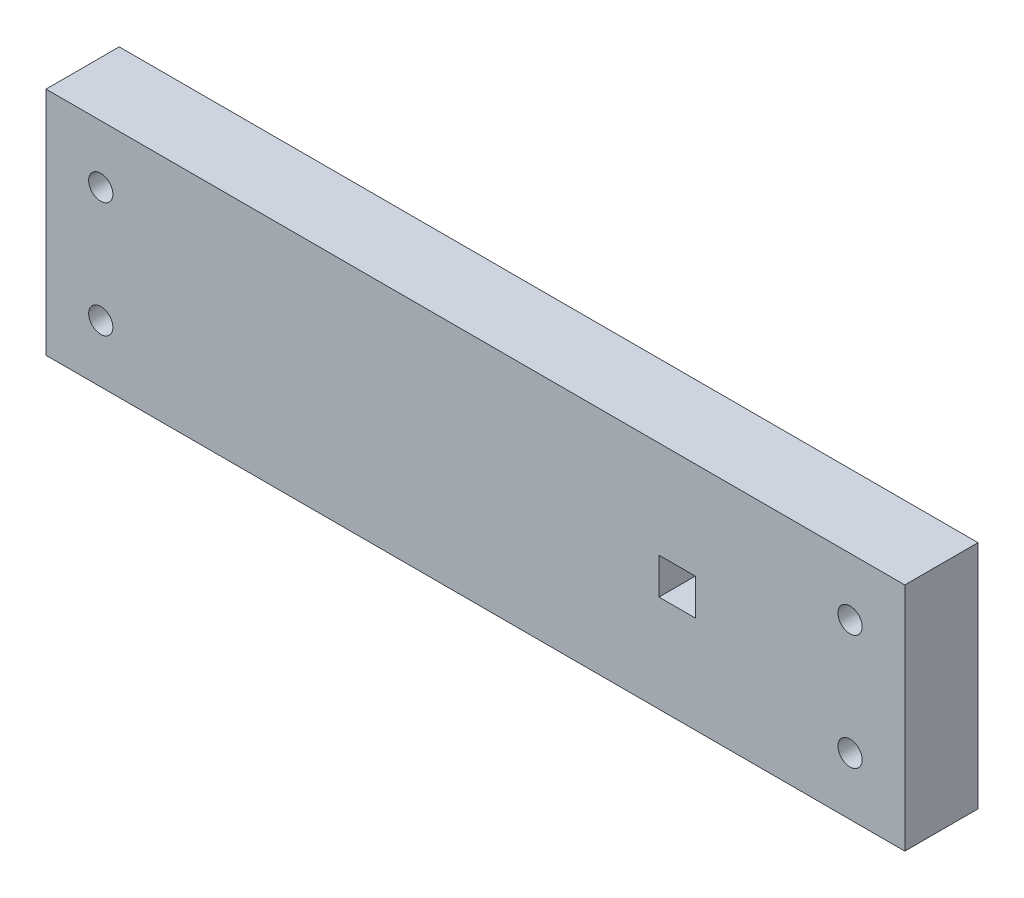
ISO-10303-21;
HEADER;
FILE_DESCRIPTION(('STEP AP214'),'2;1');
FILE_NAME('part.step','',(''),(''),'','','');
FILE_SCHEMA(('AUTOMOTIVE_DESIGN { 1 0 10303 214 1 1 1 1 }'));
ENDSEC;
DATA;
#1=APPLICATION_CONTEXT('core data for automotive mechanical design processes');
#2=APPLICATION_PROTOCOL_DEFINITION('international standard','automotive_design',2000,#1);
#3=PRODUCT_CONTEXT('',#1,'mechanical');
#4=PRODUCT('Part','Part','',(#3));
#5=PRODUCT_RELATED_PRODUCT_CATEGORY('part','',(#4));
#6=PRODUCT_DEFINITION_FORMATION('','',#4);
#7=PRODUCT_DEFINITION_CONTEXT('part definition',#1,'design');
#8=PRODUCT_DEFINITION('design','',#6,#7);
#9=PRODUCT_DEFINITION_SHAPE('','',#8);
#10=(LENGTH_UNIT() NAMED_UNIT(*) SI_UNIT(.MILLI.,.METRE.));
#11=(NAMED_UNIT(*) PLANE_ANGLE_UNIT() SI_UNIT($,.RADIAN.));
#12=(NAMED_UNIT(*) SI_UNIT($,.STERADIAN.) SOLID_ANGLE_UNIT());
#13=UNCERTAINTY_MEASURE_WITH_UNIT(LENGTH_MEASURE(1.E-05),#10,'distance_accuracy_value','');
#14=(GEOMETRIC_REPRESENTATION_CONTEXT(3) GLOBAL_UNCERTAINTY_ASSIGNED_CONTEXT((#13)) GLOBAL_UNIT_ASSIGNED_CONTEXT((#10,
#11,#12)) REPRESENTATION_CONTEXT('',''));
#15=CARTESIAN_POINT('',(0.,0.,0.));
#16=DIRECTION('',(0.,0.,1.));
#17=DIRECTION('',(1.,0.,0.));
#18=AXIS2_PLACEMENT_3D('',#15,#16,#17);
#19=CARTESIAN_POINT('',(0.,0.,12.7));
#20=DIRECTION('',(0.,0.,1.));
#21=DIRECTION('',(1.,0.,0.));
#22=AXIS2_PLACEMENT_3D('',#19,#20,#21);
#23=PLANE('',#22);
#24=CARTESIAN_POINT('',(-65.,30.,12.7));
#25=DIRECTION('',(0.,0.,1.));
#26=DIRECTION('',(1.,0.,0.));
#27=AXIS2_PLACEMENT_3D('',#24,#25,#26);
#28=CIRCLE('',#27,2.09999999999999);
#29=CARTESIAN_POINT('',(-62.9,30.,12.7));
#30=VERTEX_POINT('',#29);
#31=EDGE_CURVE('E332',#30,#30,#28,.T.);
#32=ORIENTED_EDGE('',*,*,#31,.F.);
#33=EDGE_LOOP('',(#32));
#34=FACE_BOUND('',#33,.T.);
#35=CARTESIAN_POINT('',(-65.,10.,12.7));
#36=DIRECTION('',(0.,0.,1.));
#37=DIRECTION('',(1.,0.,0.));
#38=AXIS2_PLACEMENT_3D('',#35,#36,#37);
#39=CIRCLE('',#38,2.09999999999999);
#40=CARTESIAN_POINT('',(-62.9,10.,12.7));
#41=VERTEX_POINT('',#40);
#42=EDGE_CURVE('E336',#41,#41,#39,.T.);
#43=ORIENTED_EDGE('',*,*,#42,.F.);
#44=EDGE_LOOP('',(#43));
#45=FACE_BOUND('',#44,.T.);
#46=CARTESIAN_POINT('',(65.,10.,12.7));
#47=DIRECTION('',(0.,0.,1.));
#48=DIRECTION('',(1.,0.,0.));
#49=AXIS2_PLACEMENT_3D('',#46,#47,#48);
#50=CIRCLE('',#49,2.09999999999999);
#51=CARTESIAN_POINT('',(67.1,10.,12.7));
#52=VERTEX_POINT('',#51);
#53=EDGE_CURVE('E346',#52,#52,#50,.T.);
#54=ORIENTED_EDGE('',*,*,#53,.F.);
#55=EDGE_LOOP('',(#54));
#56=FACE_BOUND('',#55,.T.);
#57=CARTESIAN_POINT('',(65.,30.,12.7));
#58=DIRECTION('',(0.,0.,1.));
#59=DIRECTION('',(1.,0.,0.));
#60=AXIS2_PLACEMENT_3D('',#57,#58,#59);
#61=CIRCLE('',#60,2.09999999999999);
#62=CARTESIAN_POINT('',(67.1,30.,12.7));
#63=VERTEX_POINT('',#62);
#64=EDGE_CURVE('E354',#63,#63,#61,.T.);
#65=ORIENTED_EDGE('',*,*,#64,.F.);
#66=EDGE_LOOP('',(#65));
#67=FACE_BOUND('',#66,.T.);
#68=DIRECTION('',(0.,-1.,0.));
#69=VECTOR('',#68,1.);
#70=CARTESIAN_POINT('',(-74.5,40.,12.7));
#71=LINE('',#70,#69);
#72=CARTESIAN_POINT('',(-74.5,40.,12.7));
#73=VERTEX_POINT('',#72);
#74=CARTESIAN_POINT('',(-74.5,0.,12.7));
#75=VERTEX_POINT('',#74);
#76=EDGE_CURVE('E195',#73,#75,#71,.T.);
#77=ORIENTED_EDGE('',*,*,#76,.T.);
#78=DIRECTION('',(1.,0.,0.));
#79=VECTOR('',#78,1.);
#80=CARTESIAN_POINT('',(-74.5,0.,12.7));
#81=LINE('',#80,#79);
#82=CARTESIAN_POINT('',(74.5,0.,12.7));
#83=VERTEX_POINT('',#82);
#84=EDGE_CURVE('E199',#75,#83,#81,.T.);
#85=ORIENTED_EDGE('',*,*,#84,.T.);
#86=DIRECTION('',(0.,1.,0.));
#87=VECTOR('',#86,1.);
#88=CARTESIAN_POINT('',(74.5,40.,12.7));
#89=LINE('',#88,#87);
#90=CARTESIAN_POINT('',(74.5,40.,12.7));
#91=VERTEX_POINT('',#90);
#92=EDGE_CURVE('E203',#83,#91,#89,.T.);
#93=ORIENTED_EDGE('',*,*,#92,.T.);
#94=DIRECTION('',(-1.,0.,0.));
#95=VECTOR('',#94,1.);
#96=CARTESIAN_POINT('',(-74.5,40.,12.7));
#97=LINE('',#96,#95);
#98=EDGE_CURVE('E206',#91,#73,#97,.T.);
#99=ORIENTED_EDGE('',*,*,#98,.T.);
#100=EDGE_LOOP('',(#77,#85,#93,#99));
#101=FACE_BOUND('',#100,.T.);
#102=DIRECTION('',(1.,0.,0.));
#103=VECTOR('',#102,1.);
#104=CARTESIAN_POINT('',(31.85,16.85,12.7));
#105=LINE('',#104,#103);
#106=CARTESIAN_POINT('',(31.85,16.85,12.7));
#107=VERTEX_POINT('',#106);
#108=CARTESIAN_POINT('',(38.15,16.85,12.7));
#109=VERTEX_POINT('',#108);
#110=EDGE_CURVE('E159',#107,#109,#105,.T.);
#111=ORIENTED_EDGE('',*,*,#110,.F.);
#112=DIRECTION('',(0.,-1.,0.));
#113=VECTOR('',#112,1.);
#114=CARTESIAN_POINT('',(31.85,23.15,12.7));
#115=LINE('',#114,#113);
#116=CARTESIAN_POINT('',(31.85,23.15,12.7));
#117=VERTEX_POINT('',#116);
#118=EDGE_CURVE('E156',#117,#107,#115,.T.);
#119=ORIENTED_EDGE('',*,*,#118,.F.);
#120=DIRECTION('',(-1.,0.,0.));
#121=VECTOR('',#120,1.);
#122=CARTESIAN_POINT('',(31.85,23.15,12.7));
#123=LINE('',#122,#121);
#124=CARTESIAN_POINT('',(38.15,23.15,12.7));
#125=VERTEX_POINT('',#124);
#126=EDGE_CURVE('E166',#125,#117,#123,.T.);
#127=ORIENTED_EDGE('',*,*,#126,.F.);
#128=DIRECTION('',(0.,1.,0.));
#129=VECTOR('',#128,1.);
#130=CARTESIAN_POINT('',(38.15,23.15,12.7));
#131=LINE('',#130,#129);
#132=EDGE_CURVE('E163',#109,#125,#131,.T.);
#133=ORIENTED_EDGE('',*,*,#132,.F.);
#134=EDGE_LOOP('',(#111,#119,#127,#133));
#135=FACE_BOUND('',#134,.T.);
#136=ADVANCED_FACE('F46',(#34,#45,#56,#67,#101,#135),#23,.T.);
#137=CARTESIAN_POINT('',(0.,0.,0.));
#138=DIRECTION('',(0.,0.,1.));
#139=DIRECTION('',(1.,0.,0.));
#140=AXIS2_PLACEMENT_3D('',#137,#138,#139);
#141=PLANE('',#140);
#142=CARTESIAN_POINT('',(-65.,30.,0.));
#143=DIRECTION('',(0.,0.,1.));
#144=DIRECTION('',(1.,0.,0.));
#145=AXIS2_PLACEMENT_3D('',#142,#143,#144);
#146=CIRCLE('',#145,2.09999999999999);
#147=CARTESIAN_POINT('',(-62.9,30.,0.));
#148=VERTEX_POINT('',#147);
#149=EDGE_CURVE('E330',#148,#148,#146,.T.);
#150=ORIENTED_EDGE('',*,*,#149,.T.);
#151=EDGE_LOOP('',(#150));
#152=FACE_BOUND('',#151,.T.);
#153=CARTESIAN_POINT('',(-65.,10.,0.));
#154=DIRECTION('',(0.,0.,1.));
#155=DIRECTION('',(1.,0.,0.));
#156=AXIS2_PLACEMENT_3D('',#153,#154,#155);
#157=CIRCLE('',#156,2.09999999999999);
#158=CARTESIAN_POINT('',(-62.9,10.,0.));
#159=VERTEX_POINT('',#158);
#160=EDGE_CURVE('E342',#159,#159,#157,.T.);
#161=ORIENTED_EDGE('',*,*,#160,.T.);
#162=EDGE_LOOP('',(#161));
#163=FACE_BOUND('',#162,.T.);
#164=CARTESIAN_POINT('',(65.,10.,0.));
#165=DIRECTION('',(0.,0.,1.));
#166=DIRECTION('',(1.,0.,0.));
#167=AXIS2_PLACEMENT_3D('',#164,#165,#166);
#168=CIRCLE('',#167,2.09999999999999);
#169=CARTESIAN_POINT('',(67.1,10.,0.));
#170=VERTEX_POINT('',#169);
#171=EDGE_CURVE('E350',#170,#170,#168,.T.);
#172=ORIENTED_EDGE('',*,*,#171,.T.);
#173=EDGE_LOOP('',(#172));
#174=FACE_BOUND('',#173,.T.);
#175=CARTESIAN_POINT('',(65.,30.,0.));
#176=DIRECTION('',(0.,0.,1.));
#177=DIRECTION('',(1.,0.,0.));
#178=AXIS2_PLACEMENT_3D('',#175,#176,#177);
#179=CIRCLE('',#178,2.09999999999999);
#180=CARTESIAN_POINT('',(67.1,30.,0.));
#181=VERTEX_POINT('',#180);
#182=EDGE_CURVE('E141',#181,#181,#179,.T.);
#183=ORIENTED_EDGE('',*,*,#182,.T.);
#184=EDGE_LOOP('',(#183));
#185=FACE_BOUND('',#184,.T.);
#186=DIRECTION('',(0.,-1.,0.));
#187=VECTOR('',#186,1.);
#188=CARTESIAN_POINT('',(-74.5,40.,0.));
#189=LINE('',#188,#187);
#190=CARTESIAN_POINT('',(-74.5,40.,0.));
#191=VERTEX_POINT('',#190);
#192=CARTESIAN_POINT('',(-74.5,0.,0.));
#193=VERTEX_POINT('',#192);
#194=EDGE_CURVE('E194',#191,#193,#189,.T.);
#195=ORIENTED_EDGE('',*,*,#194,.F.);
#196=DIRECTION('',(-1.,0.,0.));
#197=VECTOR('',#196,1.);
#198=CARTESIAN_POINT('',(-74.5,40.,0.));
#199=LINE('',#198,#197);
#200=CARTESIAN_POINT('',(74.5,40.,0.));
#201=VERTEX_POINT('',#200);
#202=EDGE_CURVE('E200',#201,#191,#199,.T.);
#203=ORIENTED_EDGE('',*,*,#202,.F.);
#204=DIRECTION('',(0.,1.,0.));
#205=VECTOR('',#204,1.);
#206=CARTESIAN_POINT('',(74.5,40.,0.));
#207=LINE('',#206,#205);
#208=CARTESIAN_POINT('',(74.5,0.,0.));
#209=VERTEX_POINT('',#208);
#210=EDGE_CURVE('E216',#209,#201,#207,.T.);
#211=ORIENTED_EDGE('',*,*,#210,.F.);
#212=DIRECTION('',(1.,0.,0.));
#213=VECTOR('',#212,1.);
#214=CARTESIAN_POINT('',(-74.5,0.,0.));
#215=LINE('',#214,#213);
#216=EDGE_CURVE('E213',#193,#209,#215,.T.);
#217=ORIENTED_EDGE('',*,*,#216,.F.);
#218=EDGE_LOOP('',(#195,#203,#211,#217));
#219=FACE_BOUND('',#218,.T.);
#220=DIRECTION('',(0.,-1.,0.));
#221=VECTOR('',#220,1.);
#222=CARTESIAN_POINT('',(31.85,23.15,0.));
#223=LINE('',#222,#221);
#224=CARTESIAN_POINT('',(31.85,23.15,0.));
#225=VERTEX_POINT('',#224);
#226=CARTESIAN_POINT('',(31.85,16.85,0.));
#227=VERTEX_POINT('',#226);
#228=EDGE_CURVE('E70',#225,#227,#223,.T.);
#229=ORIENTED_EDGE('',*,*,#228,.T.);
#230=DIRECTION('',(1.,0.,0.));
#231=VECTOR('',#230,1.);
#232=CARTESIAN_POINT('',(31.85,16.85,0.));
#233=LINE('',#232,#231);
#234=CARTESIAN_POINT('',(38.15,16.85,0.));
#235=VERTEX_POINT('',#234);
#236=EDGE_CURVE('E172',#227,#235,#233,.T.);
#237=ORIENTED_EDGE('',*,*,#236,.T.);
#238=DIRECTION('',(0.,1.,0.));
#239=VECTOR('',#238,1.);
#240=CARTESIAN_POINT('',(38.15,23.15,0.));
#241=LINE('',#240,#239);
#242=CARTESIAN_POINT('',(38.15,23.15,0.));
#243=VERTEX_POINT('',#242);
#244=EDGE_CURVE('E182',#235,#243,#241,.T.);
#245=ORIENTED_EDGE('',*,*,#244,.T.);
#246=DIRECTION('',(-1.,0.,0.));
#247=VECTOR('',#246,1.);
#248=CARTESIAN_POINT('',(31.85,23.15,0.));
#249=LINE('',#248,#247);
#250=EDGE_CURVE('E160',#243,#225,#249,.T.);
#251=ORIENTED_EDGE('',*,*,#250,.T.);
#252=EDGE_LOOP('',(#229,#237,#245,#251));
#253=FACE_BOUND('',#252,.T.);
#254=ADVANCED_FACE('F239',(#152,#163,#174,#185,#219,#253),#141,.F.);
#255=CARTESIAN_POINT('',(-74.5,40.,12.7));
#256=DIRECTION('',(1.,0.,0.));
#257=DIRECTION('',(0.,0.,-1.));
#258=AXIS2_PLACEMENT_3D('',#255,#256,#257);
#259=PLANE('',#258);
#260=ORIENTED_EDGE('',*,*,#194,.T.);
#261=DIRECTION('',(0.,0.,-1.));
#262=VECTOR('',#261,1.);
#263=CARTESIAN_POINT('',(-74.5,0.,12.7));
#264=LINE('',#263,#262);
#265=EDGE_CURVE('E12',#75,#193,#264,.T.);
#266=ORIENTED_EDGE('',*,*,#265,.F.);
#267=ORIENTED_EDGE('',*,*,#76,.F.);
#268=DIRECTION('',(0.,0.,-1.));
#269=VECTOR('',#268,1.);
#270=CARTESIAN_POINT('',(-74.5,40.,12.7));
#271=LINE('',#270,#269);
#272=EDGE_CURVE('E209',#73,#191,#271,.T.);
#273=ORIENTED_EDGE('',*,*,#272,.T.);
#274=EDGE_LOOP('',(#260,#266,#267,#273));
#275=FACE_BOUND('',#274,.T.);
#276=ADVANCED_FACE('F48',(#275),#259,.F.);
#277=CARTESIAN_POINT('',(-74.5,0.,12.7));
#278=DIRECTION('',(0.,1.,0.));
#279=DIRECTION('',(-1.,0.,0.));
#280=AXIS2_PLACEMENT_3D('',#277,#278,#279);
#281=PLANE('',#280);
#282=CARTESIAN_POINT('',(-60.,0.,6.35));
#283=DIRECTION('',(0.,-1.,0.));
#284=DIRECTION('',(0.,0.,-1.));
#285=AXIS2_PLACEMENT_3D('',#282,#283,#284);
#286=CIRCLE('',#285,2.09999999999999);
#287=CARTESIAN_POINT('',(-60.,0.,4.25000000000001));
#288=VERTEX_POINT('',#287);
#289=EDGE_CURVE('E133',#288,#288,#286,.T.);
#290=ORIENTED_EDGE('',*,*,#289,.F.);
#291=EDGE_LOOP('',(#290));
#292=FACE_BOUND('',#291,.T.);
#293=CARTESIAN_POINT('',(0.,0.,6.35));
#294=DIRECTION('',(0.,-1.,0.));
#295=DIRECTION('',(0.,0.,-1.));
#296=AXIS2_PLACEMENT_3D('',#293,#294,#295);
#297=CIRCLE('',#296,2.09999999999999);
#298=CARTESIAN_POINT('',(0.,0.,4.25000000000001));
#299=VERTEX_POINT('',#298);
#300=EDGE_CURVE('E132',#299,#299,#297,.T.);
#301=ORIENTED_EDGE('',*,*,#300,.F.);
#302=EDGE_LOOP('',(#301));
#303=FACE_BOUND('',#302,.T.);
#304=CARTESIAN_POINT('',(60.,0.,6.35));
#305=DIRECTION('',(0.,-1.,0.));
#306=DIRECTION('',(0.,0.,-1.));
#307=AXIS2_PLACEMENT_3D('',#304,#305,#306);
#308=CIRCLE('',#307,2.09999999999999);
#309=CARTESIAN_POINT('',(60.,0.,4.25000000000001));
#310=VERTEX_POINT('',#309);
#311=EDGE_CURVE('E148',#310,#310,#308,.T.);
#312=ORIENTED_EDGE('',*,*,#311,.F.);
#313=EDGE_LOOP('',(#312));
#314=FACE_BOUND('',#313,.T.);
#315=ORIENTED_EDGE('',*,*,#216,.T.);
#316=DIRECTION('',(0.,0.,-1.));
#317=VECTOR('',#316,1.);
#318=CARTESIAN_POINT('',(74.5,0.,12.7));
#319=LINE('',#318,#317);
#320=EDGE_CURVE('E55',#83,#209,#319,.T.);
#321=ORIENTED_EDGE('',*,*,#320,.F.);
#322=ORIENTED_EDGE('',*,*,#84,.F.);
#323=ORIENTED_EDGE('',*,*,#265,.T.);
#324=EDGE_LOOP('',(#315,#321,#322,#323));
#325=FACE_BOUND('',#324,.T.);
#326=ADVANCED_FACE('F250',(#292,#303,#314,#325),#281,.F.);
#327=CARTESIAN_POINT('',(74.5,40.,12.7));
#328=DIRECTION('',(-1.,0.,0.));
#329=DIRECTION('',(0.,0.,1.));
#330=AXIS2_PLACEMENT_3D('',#327,#328,#329);
#331=PLANE('',#330);
#332=ORIENTED_EDGE('',*,*,#210,.T.);
#333=DIRECTION('',(0.,0.,-1.));
#334=VECTOR('',#333,1.);
#335=CARTESIAN_POINT('',(74.5,40.,12.7));
#336=LINE('',#335,#334);
#337=EDGE_CURVE('E224',#91,#201,#336,.T.);
#338=ORIENTED_EDGE('',*,*,#337,.F.);
#339=ORIENTED_EDGE('',*,*,#92,.F.);
#340=ORIENTED_EDGE('',*,*,#320,.T.);
#341=EDGE_LOOP('',(#332,#338,#339,#340));
#342=FACE_BOUND('',#341,.T.);
#343=ADVANCED_FACE('F233',(#342),#331,.F.);
#344=CARTESIAN_POINT('',(-74.5,40.,12.7));
#345=DIRECTION('',(0.,-1.,0.));
#346=DIRECTION('',(0.,0.,-1.));
#347=AXIS2_PLACEMENT_3D('',#344,#345,#346);
#348=PLANE('',#347);
#349=ORIENTED_EDGE('',*,*,#202,.T.);
#350=ORIENTED_EDGE('',*,*,#272,.F.);
#351=ORIENTED_EDGE('',*,*,#98,.F.);
#352=ORIENTED_EDGE('',*,*,#337,.T.);
#353=EDGE_LOOP('',(#349,#350,#351,#352));
#354=FACE_BOUND('',#353,.T.);
#355=ADVANCED_FACE('F243',(#354),#348,.F.);
#356=CARTESIAN_POINT('',(31.85,23.15,12.7));
#357=DIRECTION('',(1.,0.,0.));
#358=DIRECTION('',(0.,0.,-1.));
#359=AXIS2_PLACEMENT_3D('',#356,#357,#358);
#360=PLANE('',#359);
#361=ORIENTED_EDGE('',*,*,#228,.F.);
#362=DIRECTION('',(0.,0.,-1.));
#363=VECTOR('',#362,1.);
#364=CARTESIAN_POINT('',(31.85,23.15,12.7));
#365=LINE('',#364,#363);
#366=EDGE_CURVE('E169',#117,#225,#365,.T.);
#367=ORIENTED_EDGE('',*,*,#366,.F.);
#368=ORIENTED_EDGE('',*,*,#118,.T.);
#369=DIRECTION('',(0.,0.,-1.));
#370=VECTOR('',#369,1.);
#371=CARTESIAN_POINT('',(31.85,16.85,12.7));
#372=LINE('',#371,#370);
#373=EDGE_CURVE('E191',#107,#227,#372,.T.);
#374=ORIENTED_EDGE('',*,*,#373,.T.);
#375=EDGE_LOOP('',(#361,#367,#368,#374));
#376=FACE_BOUND('',#375,.T.);
#377=ADVANCED_FACE('F271',(#376),#360,.T.);
#378=CARTESIAN_POINT('',(31.85,16.85,12.7));
#379=DIRECTION('',(0.,1.,0.));
#380=DIRECTION('',(0.,0.,1.));
#381=AXIS2_PLACEMENT_3D('',#378,#379,#380);
#382=PLANE('',#381);
#383=ORIENTED_EDGE('',*,*,#236,.F.);
#384=ORIENTED_EDGE('',*,*,#373,.F.);
#385=ORIENTED_EDGE('',*,*,#110,.T.);
#386=DIRECTION('',(0.,0.,-1.));
#387=VECTOR('',#386,1.);
#388=CARTESIAN_POINT('',(38.15,16.85,12.7));
#389=LINE('',#388,#387);
#390=EDGE_CURVE('E188',#109,#235,#389,.T.);
#391=ORIENTED_EDGE('',*,*,#390,.T.);
#392=EDGE_LOOP('',(#383,#384,#385,#391));
#393=FACE_BOUND('',#392,.T.);
#394=ADVANCED_FACE('F278',(#393),#382,.T.);
#395=CARTESIAN_POINT('',(38.15,23.15,12.7));
#396=DIRECTION('',(-1.,0.,0.));
#397=DIRECTION('',(0.,0.,1.));
#398=AXIS2_PLACEMENT_3D('',#395,#396,#397);
#399=PLANE('',#398);
#400=ORIENTED_EDGE('',*,*,#244,.F.);
#401=ORIENTED_EDGE('',*,*,#390,.F.);
#402=ORIENTED_EDGE('',*,*,#132,.T.);
#403=DIRECTION('',(0.,0.,-1.));
#404=VECTOR('',#403,1.);
#405=CARTESIAN_POINT('',(38.15,23.15,12.7));
#406=LINE('',#405,#404);
#407=EDGE_CURVE('E62',#125,#243,#406,.T.);
#408=ORIENTED_EDGE('',*,*,#407,.T.);
#409=EDGE_LOOP('',(#400,#401,#402,#408));
#410=FACE_BOUND('',#409,.T.);
#411=ADVANCED_FACE('F282',(#410),#399,.T.);
#412=CARTESIAN_POINT('',(31.85,23.15,12.7));
#413=DIRECTION('',(0.,-1.,0.));
#414=DIRECTION('',(0.,0.,-1.));
#415=AXIS2_PLACEMENT_3D('',#412,#413,#414);
#416=PLANE('',#415);
#417=ORIENTED_EDGE('',*,*,#250,.F.);
#418=ORIENTED_EDGE('',*,*,#407,.F.);
#419=ORIENTED_EDGE('',*,*,#126,.T.);
#420=ORIENTED_EDGE('',*,*,#366,.T.);
#421=EDGE_LOOP('',(#417,#418,#419,#420));
#422=FACE_BOUND('',#421,.T.);
#423=ADVANCED_FACE('F287',(#422),#416,.T.);
#424=CARTESIAN_POINT('',(60.,7.,6.35));
#425=DIRECTION('',(0.,-1.,0.));
#426=DIRECTION('',(0.,0.,-1.));
#427=AXIS2_PLACEMENT_3D('',#424,#425,#426);
#428=CONICAL_SURFACE('',#427,2.1,1.02974425867665);
#429=CARTESIAN_POINT('',(60.,8.26180729995788,6.35));
#430=VERTEX_POINT('',#429);
#431=VERTEX_LOOP('',#430);
#432=FACE_BOUND('',#431,.T.);
#433=CARTESIAN_POINT('',(60.,7.,6.35));
#434=DIRECTION('',(0.,-1.,0.));
#435=DIRECTION('',(0.,0.,-1.));
#436=AXIS2_PLACEMENT_3D('',#433,#434,#435);
#437=CIRCLE('',#436,2.1);
#438=CARTESIAN_POINT('',(60.,7.,4.25));
#439=VERTEX_POINT('',#438);
#440=EDGE_CURVE('E152',#439,#439,#437,.T.);
#441=ORIENTED_EDGE('',*,*,#440,.T.);
#442=EDGE_LOOP('',(#441));
#443=FACE_BOUND('',#442,.T.);
#444=ADVANCED_FACE('F293',(#432,#443),#428,.F.);
#445=CARTESIAN_POINT('',(60.,0.,6.35));
#446=DIRECTION('',(0.,-1.,0.));
#447=DIRECTION('',(0.,0.,-1.));
#448=AXIS2_PLACEMENT_3D('',#445,#446,#447);
#449=CYLINDRICAL_SURFACE('',#448,2.09999999999999);
#450=ORIENTED_EDGE('',*,*,#440,.F.);
#451=EDGE_LOOP('',(#450));
#452=FACE_BOUND('',#451,.T.);
#453=ORIENTED_EDGE('',*,*,#311,.T.);
#454=EDGE_LOOP('',(#453));
#455=FACE_BOUND('',#454,.T.);
#456=ADVANCED_FACE('F296',(#452,#455),#449,.F.);
#457=CARTESIAN_POINT('',(0.,7.,6.35));
#458=DIRECTION('',(0.,-1.,0.));
#459=DIRECTION('',(0.,0.,-1.));
#460=AXIS2_PLACEMENT_3D('',#457,#458,#459);
#461=CONICAL_SURFACE('',#460,2.1,1.02974425867665);
#462=CARTESIAN_POINT('',(0.,8.26180729995788,6.35));
#463=VERTEX_POINT('',#462);
#464=VERTEX_LOOP('',#463);
#465=FACE_BOUND('',#464,.T.);
#466=CARTESIAN_POINT('',(0.,7.,6.35));
#467=DIRECTION('',(0.,-1.,0.));
#468=DIRECTION('',(0.,0.,-1.));
#469=AXIS2_PLACEMENT_3D('',#466,#467,#468);
#470=CIRCLE('',#469,2.1);
#471=CARTESIAN_POINT('',(0.,7.,4.25));
#472=VERTEX_POINT('',#471);
#473=EDGE_CURVE('E138',#472,#472,#470,.T.);
#474=ORIENTED_EDGE('',*,*,#473,.T.);
#475=EDGE_LOOP('',(#474));
#476=FACE_BOUND('',#475,.T.);
#477=ADVANCED_FACE('F300',(#465,#476),#461,.F.);
#478=CARTESIAN_POINT('',(0.,0.,6.35));
#479=DIRECTION('',(0.,-1.,0.));
#480=DIRECTION('',(0.,0.,-1.));
#481=AXIS2_PLACEMENT_3D('',#478,#479,#480);
#482=CYLINDRICAL_SURFACE('',#481,2.09999999999999);
#483=ORIENTED_EDGE('',*,*,#473,.F.);
#484=EDGE_LOOP('',(#483));
#485=FACE_BOUND('',#484,.T.);
#486=ORIENTED_EDGE('',*,*,#300,.T.);
#487=EDGE_LOOP('',(#486));
#488=FACE_BOUND('',#487,.T.);
#489=ADVANCED_FACE('F125',(#485,#488),#482,.F.);
#490=CARTESIAN_POINT('',(-60.,7.,6.35));
#491=DIRECTION('',(0.,-1.,0.));
#492=DIRECTION('',(0.,0.,-1.));
#493=AXIS2_PLACEMENT_3D('',#490,#491,#492);
#494=CONICAL_SURFACE('',#493,2.1,1.02974425867665);
#495=CARTESIAN_POINT('',(-60.,8.26180729995788,6.35));
#496=VERTEX_POINT('',#495);
#497=VERTEX_LOOP('',#496);
#498=FACE_BOUND('',#497,.T.);
#499=CARTESIAN_POINT('',(-60.,7.,6.35));
#500=DIRECTION('',(0.,-1.,0.));
#501=DIRECTION('',(0.,0.,-1.));
#502=AXIS2_PLACEMENT_3D('',#499,#500,#501);
#503=CIRCLE('',#502,2.1);
#504=CARTESIAN_POINT('',(-60.,7.,4.25));
#505=VERTEX_POINT('',#504);
#506=EDGE_CURVE('E129',#505,#505,#503,.T.);
#507=ORIENTED_EDGE('',*,*,#506,.T.);
#508=EDGE_LOOP('',(#507));
#509=FACE_BOUND('',#508,.T.);
#510=ADVANCED_FACE('F121',(#498,#509),#494,.F.);
#511=CARTESIAN_POINT('',(-60.,0.,6.35));
#512=DIRECTION('',(0.,-1.,0.));
#513=DIRECTION('',(0.,0.,-1.));
#514=AXIS2_PLACEMENT_3D('',#511,#512,#513);
#515=CYLINDRICAL_SURFACE('',#514,2.09999999999999);
#516=ORIENTED_EDGE('',*,*,#506,.F.);
#517=EDGE_LOOP('',(#516));
#518=FACE_BOUND('',#517,.T.);
#519=ORIENTED_EDGE('',*,*,#289,.T.);
#520=EDGE_LOOP('',(#519));
#521=FACE_BOUND('',#520,.T.);
#522=ADVANCED_FACE('F124',(#518,#521),#515,.F.);
#523=CARTESIAN_POINT('',(65.,30.,12.7));
#524=DIRECTION('',(0.,0.,1.));
#525=DIRECTION('',(1.,0.,0.));
#526=AXIS2_PLACEMENT_3D('',#523,#524,#525);
#527=CYLINDRICAL_SURFACE('',#526,2.09999999999999);
#528=ORIENTED_EDGE('',*,*,#182,.F.);
#529=EDGE_LOOP('',(#528));
#530=FACE_BOUND('',#529,.T.);
#531=ORIENTED_EDGE('',*,*,#64,.T.);
#532=EDGE_LOOP('',(#531));
#533=FACE_BOUND('',#532,.T.);
#534=ADVANCED_FACE('F310',(#530,#533),#527,.F.);
#535=CARTESIAN_POINT('',(65.,10.,12.7));
#536=DIRECTION('',(0.,0.,1.));
#537=DIRECTION('',(1.,0.,0.));
#538=AXIS2_PLACEMENT_3D('',#535,#536,#537);
#539=CYLINDRICAL_SURFACE('',#538,2.09999999999999);
#540=ORIENTED_EDGE('',*,*,#171,.F.);
#541=EDGE_LOOP('',(#540));
#542=FACE_BOUND('',#541,.T.);
#543=ORIENTED_EDGE('',*,*,#53,.T.);
#544=EDGE_LOOP('',(#543));
#545=FACE_BOUND('',#544,.T.);
#546=ADVANCED_FACE('F313',(#542,#545),#539,.F.);
#547=CARTESIAN_POINT('',(-65.,10.,12.7));
#548=DIRECTION('',(0.,0.,1.));
#549=DIRECTION('',(1.,0.,0.));
#550=AXIS2_PLACEMENT_3D('',#547,#548,#549);
#551=CYLINDRICAL_SURFACE('',#550,2.09999999999999);
#552=ORIENTED_EDGE('',*,*,#160,.F.);
#553=EDGE_LOOP('',(#552));
#554=FACE_BOUND('',#553,.T.);
#555=ORIENTED_EDGE('',*,*,#42,.T.);
#556=EDGE_LOOP('',(#555));
#557=FACE_BOUND('',#556,.T.);
#558=ADVANCED_FACE('F317',(#554,#557),#551,.F.);
#559=CARTESIAN_POINT('',(-65.,30.,12.7));
#560=DIRECTION('',(0.,0.,1.));
#561=DIRECTION('',(1.,0.,0.));
#562=AXIS2_PLACEMENT_3D('',#559,#560,#561);
#563=CYLINDRICAL_SURFACE('',#562,2.09999999999999);
#564=ORIENTED_EDGE('',*,*,#149,.F.);
#565=EDGE_LOOP('',(#564));
#566=FACE_BOUND('',#565,.T.);
#567=ORIENTED_EDGE('',*,*,#31,.T.);
#568=EDGE_LOOP('',(#567));
#569=FACE_BOUND('',#568,.T.);
#570=ADVANCED_FACE('F321',(#566,#569),#563,.F.);
#571=CLOSED_SHELL('',(#136,#254,#276,#326,#343,#355,#377,#394,#411,#423,#444,#456,#477,#489,
#510,#522,#534,#546,#558,#570));
#572=MANIFOLD_SOLID_BREP('B2',#571);
#573=ADVANCED_BREP_SHAPE_REPRESENTATION('',(#18,#572),#14);
#574=SHAPE_DEFINITION_REPRESENTATION(#9,#573);
ENDSEC;
END-ISO-10303-21;
